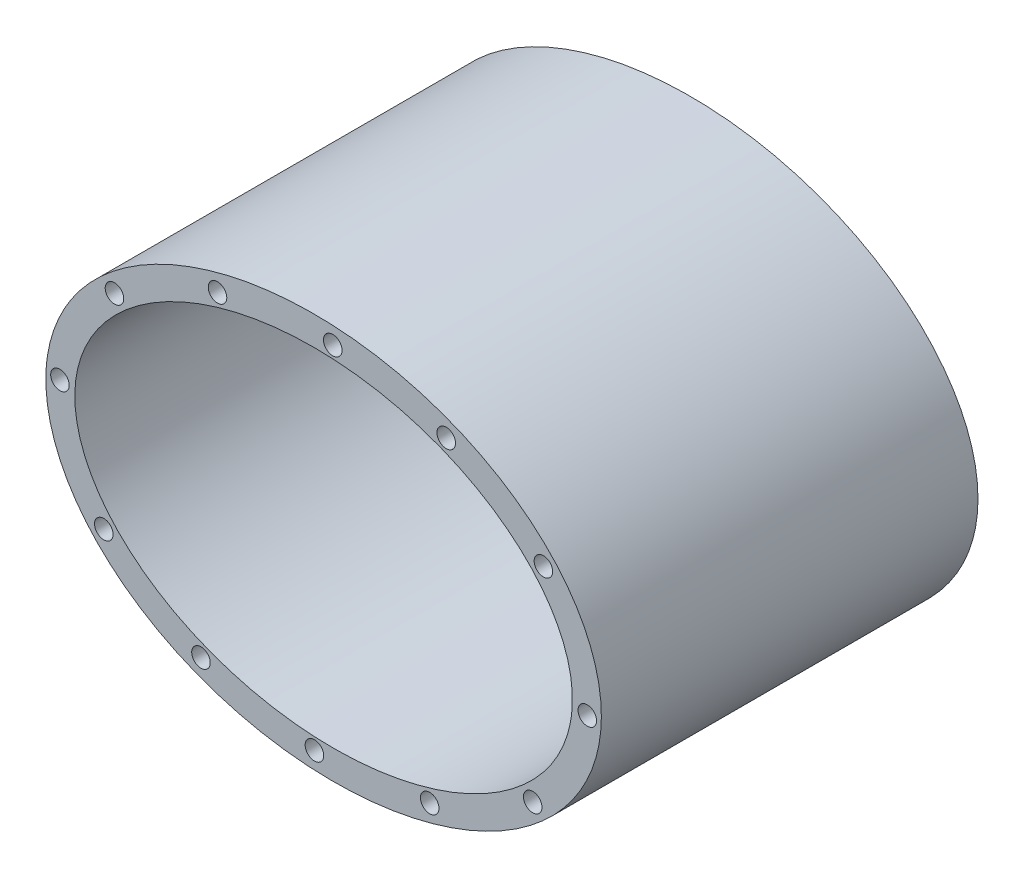
ISO-10303-21;
HEADER;
FILE_DESCRIPTION(('STEP AP214'),'2;1');
FILE_NAME('part.step','',(''),(''),'','','');
FILE_SCHEMA(('AUTOMOTIVE_DESIGN { 1 0 10303 214 1 1 1 1 }'));
ENDSEC;
DATA;
#1=APPLICATION_CONTEXT('core data for automotive mechanical design processes');
#2=APPLICATION_PROTOCOL_DEFINITION('international standard','automotive_design',2000,#1);
#3=PRODUCT_CONTEXT('',#1,'mechanical');
#4=PRODUCT('Part','Part','',(#3));
#5=PRODUCT_RELATED_PRODUCT_CATEGORY('part','',(#4));
#6=PRODUCT_DEFINITION_FORMATION('','',#4);
#7=PRODUCT_DEFINITION_CONTEXT('part definition',#1,'design');
#8=PRODUCT_DEFINITION('design','',#6,#7);
#9=PRODUCT_DEFINITION_SHAPE('','',#8);
#10=(LENGTH_UNIT() NAMED_UNIT(*) SI_UNIT(.MILLI.,.METRE.));
#11=(NAMED_UNIT(*) PLANE_ANGLE_UNIT() SI_UNIT($,.RADIAN.));
#12=(NAMED_UNIT(*) SI_UNIT($,.STERADIAN.) SOLID_ANGLE_UNIT());
#13=UNCERTAINTY_MEASURE_WITH_UNIT(LENGTH_MEASURE(1.E-05),#10,'distance_accuracy_value','');
#14=(GEOMETRIC_REPRESENTATION_CONTEXT(3) GLOBAL_UNCERTAINTY_ASSIGNED_CONTEXT((#13)) GLOBAL_UNIT_ASSIGNED_CONTEXT((#10,
#11,#12)) REPRESENTATION_CONTEXT('',''));
#15=CARTESIAN_POINT('',(0.,0.,0.));
#16=DIRECTION('',(0.,0.,1.));
#17=DIRECTION('',(1.,0.,0.));
#18=AXIS2_PLACEMENT_3D('',#15,#16,#17);
#19=CARTESIAN_POINT('',(0.,0.,20.6375));
#20=DIRECTION('',(0.,0.,1.));
#21=DIRECTION('',(-0.998703027385171,0.050914271984342,0.));
#22=AXIS2_PLACEMENT_3D('',#19,#20,#21);
#23=ELLIPSE('',#22,30.4596794607641,21.6340379427504);
#24=DIRECTION('',(0.,0.,-1.));
#25=VECTOR('',#24,1.);
#26=SURFACE_OF_LINEAR_EXTRUSION('',#23,#25);
#27=CARTESIAN_POINT('',(-30.420174090647,1.55083240462122,20.6375));
#28=VERTEX_POINT('',#27);
#29=EDGE_CURVE('E10',#28,#28,#23,.T.);
#30=ORIENTED_EDGE('',*,*,#29,.F.);
#31=EDGE_LOOP('',(#30));
#32=FACE_BOUND('',#31,.T.);
#33=CARTESIAN_POINT('',(0.,0.,-20.6375));
#34=DIRECTION('',(0.,0.,1.));
#35=DIRECTION('',(-0.998703027385171,0.050914271984342,0.));
#36=AXIS2_PLACEMENT_3D('',#33,#34,#35);
#37=ELLIPSE('',#36,30.4596794607641,21.6340379427504);
#38=CARTESIAN_POINT('',(-30.420174090647,1.55083240462122,-20.6375));
#39=VERTEX_POINT('',#38);
#40=EDGE_CURVE('E48',#39,#39,#37,.T.);
#41=ORIENTED_EDGE('',*,*,#40,.T.);
#42=EDGE_LOOP('',(#41));
#43=FACE_BOUND('',#42,.T.);
#44=ADVANCED_FACE('F44',(#32,#43),#26,.F.);
#45=CARTESIAN_POINT('',(0.,0.,20.6375));
#46=DIRECTION('',(0.,0.,1.));
#47=DIRECTION('',(1.,0.,0.));
#48=AXIS2_PLACEMENT_3D('',#45,#46,#47);
#49=PLANE('',#48);
#50=CARTESIAN_POINT('',(-28.8955886114168,1.4731084390134,20.6375));
#51=DIRECTION('',(0.,0.,1.));
#52=DIRECTION('',(1.,0.,0.));
#53=AXIS2_PLACEMENT_3D('',#50,#51,#52);
#54=CIRCLE('',#53,1.016);
#55=CARTESIAN_POINT('',(-27.8795886114168,1.4731084390134,20.6375));
#56=VERTEX_POINT('',#55);
#57=EDGE_CURVE('E100',#56,#56,#54,.T.);
#58=ORIENTED_EDGE('',*,*,#57,.F.);
#59=EDGE_LOOP('',(#58));
#60=FACE_BOUND('',#59,.T.);
#61=CARTESIAN_POINT('',(11.6259143111857,-18.4188890862015,20.6375));
#62=DIRECTION('',(0.,0.,1.));
#63=DIRECTION('',(1.,0.,0.));
#64=AXIS2_PLACEMENT_3D('',#61,#62,#63);
#65=CIRCLE('',#64,1.016);
#66=CARTESIAN_POINT('',(12.6419143111857,-18.4188890862015,20.6375));
#67=VERTEX_POINT('',#66);
#68=EDGE_CURVE('E122',#67,#67,#65,.T.);
#69=ORIENTED_EDGE('',*,*,#68,.F.);
#70=EDGE_LOOP('',(#69));
#71=FACE_BOUND('',#70,.T.);
#72=CARTESIAN_POINT('',(-24.0875774561187,-10.2815939702579,20.6375));
#73=DIRECTION('',(0.,0.,1.));
#74=DIRECTION('',(1.,0.,0.));
#75=AXIS2_PLACEMENT_3D('',#72,#73,#74);
#76=CIRCLE('',#75,1.016);
#77=CARTESIAN_POINT('',(-23.0715774561187,-10.2815939702579,20.6375));
#78=VERTEX_POINT('',#77);
#79=EDGE_CURVE('E153',#78,#78,#76,.T.);
#80=ORIENTED_EDGE('',*,*,#79,.F.);
#81=EDGE_LOOP('',(#80));
#82=FACE_BOUND('',#81,.T.);
#83=CARTESIAN_POINT('',(-13.4387755500165,-17.1410813677872,20.6375));
#84=DIRECTION('',(0.,0.,1.));
#85=DIRECTION('',(1.,0.,0.));
#86=AXIS2_PLACEMENT_3D('',#83,#84,#85);
#87=CIRCLE('',#86,1.016);
#88=CARTESIAN_POINT('',(-12.4227755500165,-17.1410813677872,20.6375));
#89=VERTEX_POINT('',#88);
#90=EDGE_CURVE('E154',#89,#89,#87,.T.);
#91=ORIENTED_EDGE('',*,*,#90,.F.);
#92=EDGE_LOOP('',(#91));
#93=FACE_BOUND('',#92,.T.);
#94=CARTESIAN_POINT('',(-11.6259143111857,18.4188890862015,20.6375));
#95=DIRECTION('',(0.,0.,1.));
#96=DIRECTION('',(1.,0.,0.));
#97=AXIS2_PLACEMENT_3D('',#94,#95,#96);
#98=CIRCLE('',#97,1.016);
#99=CARTESIAN_POINT('',(-10.6099143111857,18.4188890862015,20.6375));
#100=VERTEX_POINT('',#99);
#101=EDGE_CURVE('E105',#100,#100,#98,.T.);
#102=ORIENTED_EDGE('',*,*,#101,.F.);
#103=EDGE_LOOP('',(#102));
#104=FACE_BOUND('',#103,.T.);
#105=CARTESIAN_POINT('',(-1.00596941963839,-19.7324770775222,20.6375));
#106=DIRECTION('',(0.,0.,1.));
#107=DIRECTION('',(1.,0.,0.));
#108=AXIS2_PLACEMENT_3D('',#105,#106,#107);
#109=CIRCLE('',#108,1.016);
#110=CARTESIAN_POINT('',(0.010030580361613,-19.7324770775222,20.6375));
#111=VERTEX_POINT('',#110);
#112=EDGE_CURVE('E88',#111,#111,#109,.T.);
#113=ORIENTED_EDGE('',*,*,#112,.F.);
#114=EDGE_LOOP('',(#113));
#115=FACE_BOUND('',#114,.T.);
#116=CARTESIAN_POINT('',(28.8955886114168,-1.4731084390134,20.6375));
#117=DIRECTION('',(0.,0.,1.));
#118=DIRECTION('',(1.,0.,0.));
#119=AXIS2_PLACEMENT_3D('',#116,#117,#118);
#120=CIRCLE('',#119,1.016);
#121=CARTESIAN_POINT('',(29.9115886114168,-1.4731084390134,20.6375));
#122=VERTEX_POINT('',#121);
#123=EDGE_CURVE('E87',#122,#122,#120,.T.);
#124=ORIENTED_EDGE('',*,*,#123,.F.);
#125=EDGE_LOOP('',(#124));
#126=FACE_BOUND('',#125,.T.);
#127=CARTESIAN_POINT('',(1.00596941963839,19.7324770775222,20.6375));
#128=DIRECTION('',(0.,0.,1.));
#129=DIRECTION('',(1.,0.,0.));
#130=AXIS2_PLACEMENT_3D('',#127,#128,#129);
#131=CIRCLE('',#130,1.016);
#132=CARTESIAN_POINT('',(2.02196941963839,19.7324770775222,20.6375));
#133=VERTEX_POINT('',#132);
#134=EDGE_CURVE('E96',#133,#133,#131,.T.);
#135=ORIENTED_EDGE('',*,*,#134,.F.);
#136=EDGE_LOOP('',(#135));
#137=FACE_BOUND('',#136,.T.);
#138=CARTESIAN_POINT('',(-22.9170929145508,12.6779104989587,20.6375));
#139=DIRECTION('',(0.,0.,1.));
#140=DIRECTION('',(1.,0.,0.));
#141=AXIS2_PLACEMENT_3D('',#138,#139,#140);
#142=CIRCLE('',#141,1.016);
#143=CARTESIAN_POINT('',(-21.9010929145508,12.6779104989587,20.6375));
#144=VERTEX_POINT('',#143);
#145=EDGE_CURVE('E106',#144,#144,#142,.T.);
#146=ORIENTED_EDGE('',*,*,#145,.F.);
#147=EDGE_LOOP('',(#146));
#148=FACE_BOUND('',#147,.T.);
#149=CARTESIAN_POINT('',(13.4387755500165,17.1410813677872,20.6375));
#150=DIRECTION('',(0.,0.,1.));
#151=DIRECTION('',(1.,0.,0.));
#152=AXIS2_PLACEMENT_3D('',#149,#150,#151);
#153=CIRCLE('',#152,1.016);
#154=CARTESIAN_POINT('',(14.4547755500165,17.1410813677872,20.6375));
#155=VERTEX_POINT('',#154);
#156=EDGE_CURVE('E138',#155,#155,#153,.T.);
#157=ORIENTED_EDGE('',*,*,#156,.F.);
#158=EDGE_LOOP('',(#157));
#159=FACE_BOUND('',#158,.T.);
#160=CARTESIAN_POINT('',(24.0875774561187,10.2815939702579,20.6375));
#161=DIRECTION('',(0.,0.,1.));
#162=DIRECTION('',(1.,0.,0.));
#163=AXIS2_PLACEMENT_3D('',#160,#161,#162);
#164=CIRCLE('',#163,1.016);
#165=CARTESIAN_POINT('',(25.1035774561187,10.2815939702579,20.6375));
#166=VERTEX_POINT('',#165);
#167=EDGE_CURVE('E130',#166,#166,#164,.T.);
#168=ORIENTED_EDGE('',*,*,#167,.F.);
#169=EDGE_LOOP('',(#168));
#170=FACE_BOUND('',#169,.T.);
#171=CARTESIAN_POINT('',(22.9170929145508,-12.6779104989587,20.6375));
#172=DIRECTION('',(0.,0.,1.));
#173=DIRECTION('',(1.,0.,0.));
#174=AXIS2_PLACEMENT_3D('',#171,#172,#173);
#175=CIRCLE('',#174,1.016);
#176=CARTESIAN_POINT('',(23.9330929145508,-12.6779104989587,20.6375));
#177=VERTEX_POINT('',#176);
#178=EDGE_CURVE('E121',#177,#177,#175,.T.);
#179=ORIENTED_EDGE('',*,*,#178,.F.);
#180=EDGE_LOOP('',(#179));
#181=FACE_BOUND('',#180,.T.);
#182=CARTESIAN_POINT('',(27.2492919786991,-1.38917959107094,20.6375));
#183=CARTESIAN_POINT('',(27.2680366005136,-1.02141338593427,20.6375));
#184=CARTESIAN_POINT('',(27.2700916226353,-0.652746123175741,20.6375));
#185=CARTESIAN_POINT('',(27.2410310502674,0.0834214939327018,20.6375));
#186=CARTESIAN_POINT('',(27.2098988493856,0.450921171709255,20.6375));
#187=CARTESIAN_POINT('',(27.1153448440354,1.18241005164078,20.6375));
#188=CARTESIAN_POINT('',(27.0518637230276,1.54639154894286,20.6375));
#189=CARTESIAN_POINT('',(26.8941972634628,2.26756321183222,20.6375));
#190=CARTESIAN_POINT('',(26.8000149079984,2.62475403366991,20.6375));
#191=CARTESIAN_POINT('',(26.583757034224,3.32775225992819,20.6375));
#192=CARTESIAN_POINT('',(26.4618861879234,3.67362288558617,20.6375));
#193=CARTESIAN_POINT('',(26.1921354799995,4.35498857654193,20.6375));
#194=CARTESIAN_POINT('',(26.0442556543348,4.69048365618361,20.6375));
#195=CARTESIAN_POINT('',(25.5651153820672,5.67942966633351,20.6375));
#196=CARTESIAN_POINT('',(25.1982229095944,6.31575380036828,20.6375));
#197=CARTESIAN_POINT('',(24.1711717057279,7.86189680089104,20.6375));
#198=CARTESIAN_POINT('',(23.4588418677711,8.73709007950519,20.6375));
#199=CARTESIAN_POINT('',(22.2940205224214,9.95585254914562,20.6375));
#200=CARTESIAN_POINT('',(21.8889614401955,10.3469895241742,20.6375));
#201=CARTESIAN_POINT('',(21.0512177545388,11.0986827109796,20.6375));
#202=CARTESIAN_POINT('',(20.6185331754913,11.4592389497474,20.6375));
#203=CARTESIAN_POINT('',(19.536108181916,12.3010895588973,20.6375));
#204=CARTESIAN_POINT('',(18.873993786314,12.7664724579432,20.6375));
#205=CARTESIAN_POINT('',(17.5118298616798,13.6380496024422,20.6375));
#206=CARTESIAN_POINT('',(16.8117647606895,14.0442192954239,20.6375));
#207=CARTESIAN_POINT('',(15.3810459554175,14.8001050146882,20.6375));
#208=CARTESIAN_POINT('',(14.6503632225458,15.1497658667581,20.6375));
#209=CARTESIAN_POINT('',(13.1654271644962,15.7943781979705,20.6375));
#210=CARTESIAN_POINT('',(12.4111743042413,16.0893307554447,20.6375));
#211=CARTESIAN_POINT('',(10.6418079792486,16.7117018374752,20.6375));
#212=CARTESIAN_POINT('',(9.61984508404543,17.0197375687995,20.6375));
#213=CARTESIAN_POINT('',(7.55326119338537,17.5474868907354,20.6375));
#214=CARTESIAN_POINT('',(6.50863332462111,17.7671732828178,20.6375));
#215=CARTESIAN_POINT('',(4.40374564856037,18.1203022009913,20.6375));
#216=CARTESIAN_POINT('',(3.34346970798796,18.2536482765864,20.6375));
#217=CARTESIAN_POINT('',(1.21577940916763,18.4344544921062,20.6375));
#218=CARTESIAN_POINT('',(0.148365905960948,18.481924740831,20.6375));
#219=CARTESIAN_POINT('',(-1.99772120832002,18.4906029583385,20.6375));
#220=CARTESIAN_POINT('',(-3.07639893921402,18.4509287794114,20.6375));
#221=CARTESIAN_POINT('',(-5.2269295524424,18.2817501379446,20.6375));
#222=CARTESIAN_POINT('',(-6.29878104461819,18.1522279332938,20.6375));
#223=CARTESIAN_POINT('',(-8.42560840388261,17.8004541651849,20.6375));
#224=CARTESIAN_POINT('',(-9.48061027537535,17.5783635351392,20.6375));
#225=CARTESIAN_POINT('',(-11.0437031243087,17.172428839118,20.6375));
#226=CARTESIAN_POINT('',(-11.5614440698733,17.0250040515521,20.6375));
#227=CARTESIAN_POINT('',(-12.5891151620363,16.705137350933,20.6375));
#228=CARTESIAN_POINT('',(-13.0990462484836,16.5326984746811,20.6375));
#229=CARTESIAN_POINT('',(-14.2337932758017,16.1163716820319,20.6375));
#230=CARTESIAN_POINT('',(-14.8560105267036,15.8653427481447,20.6375));
#231=CARTESIAN_POINT('',(-16.081895947726,15.3214231423029,20.6375));
#232=CARTESIAN_POINT('',(-16.6855653588173,15.0285352784253,20.6375));
#233=CARTESIAN_POINT('',(-17.8690646293229,14.3992672045237,20.6375));
#234=CARTESIAN_POINT('',(-18.4489194502432,14.0629341491025,20.6375));
#235=CARTESIAN_POINT('',(-19.5795888704974,13.3445304799033,20.6375));
#236=CARTESIAN_POINT('',(-20.1304113584067,12.9624723836381,20.6375));
#237=CARTESIAN_POINT('',(-21.0583882311174,12.2553964894475,20.6375));
#238=CARTESIAN_POINT('',(-21.4437018860705,11.9410709841346,20.6375));
#239=CARTESIAN_POINT('',(-22.1907904848536,11.2855068478618,20.6375));
#240=CARTESIAN_POINT('',(-22.5525662004534,10.9442691001218,20.6375));
#241=CARTESIAN_POINT('',(-23.2480642732244,10.2347969201341,20.6375));
#242=CARTESIAN_POINT('',(-23.5818153544713,9.8665908725107,20.6375));
#243=CARTESIAN_POINT('',(-24.0578982689133,9.29408077455736,20.6375));
#244=CARTESIAN_POINT('',(-24.2124928934144,9.09989024527756,20.6375));
#245=CARTESIAN_POINT('',(-24.5129187752533,8.70475772511014,20.6375));
#246=CARTESIAN_POINT('',(-24.6587478119425,8.50381404333274,20.6375));
#247=CARTESIAN_POINT('',(-25.0190946791282,7.98213573027866,20.6375));
#248=CARTESIAN_POINT('',(-25.226901171827,7.65671823149363,20.6375));
#249=CARTESIAN_POINT('',(-25.6167325332233,6.99086687506302,20.6375));
#250=CARTESIAN_POINT('',(-25.7987636069451,6.65043665745989,20.6375));
#251=CARTESIAN_POINT('',(-26.1342021650939,5.95593825796738,20.6375));
#252=CARTESIAN_POINT('',(-26.2876263003511,5.60187815514288,20.6375));
#253=CARTESIAN_POINT('',(-26.563265159795,4.88176022433971,20.6375));
#254=CARTESIAN_POINT('',(-26.6854796608856,4.51570231061812,20.6375));
#255=CARTESIAN_POINT('',(-26.8970701080686,3.77130600908812,20.6375));
#256=CARTESIAN_POINT('',(-26.9862020043824,3.39289792021969,20.6375));
#257=CARTESIAN_POINT('',(-27.128512705436,2.62935518711607,20.6375));
#258=CARTESIAN_POINT('',(-27.1816916954062,2.24422057754662,20.6375));
#259=CARTESIAN_POINT('',(-27.2510465395559,1.47073447189406,20.6375));
#260=CARTESIAN_POINT('',(-27.2672324517332,1.08238387902723,20.6375));
#261=CARTESIAN_POINT('',(-27.262539969567,0.305929441664681,20.6375));
#262=CARTESIAN_POINT('',(-27.2416638150059,-0.0821744163241208,20.6375));
#263=CARTESIAN_POINT('',(-27.167946544399,-0.812931012481122,20.6375));
#264=CARTESIAN_POINT('',(-27.1188019415678,-1.15596478843195,20.6375));
#265=CARTESIAN_POINT('',(-26.9929124388779,-1.8368743886217,20.6375));
#266=CARTESIAN_POINT('',(-26.9161705546501,-2.1747507722195,20.6375));
#267=CARTESIAN_POINT('',(-26.7366116159877,-2.84357658606893,20.6375));
#268=CARTESIAN_POINT('',(-26.6337870473739,-3.17452399035235,20.6375));
#269=CARTESIAN_POINT('',(-26.4038695432231,-3.82790179655031,20.6375));
#270=CARTESIAN_POINT('',(-26.2767715011973,-4.15033039005896,20.6375));
#271=CARTESIAN_POINT('',(-25.9508148510375,-4.89890671456069,20.6375));
#272=CARTESIAN_POINT('',(-25.7425387226978,-5.32097243937792,20.6375));
#273=CARTESIAN_POINT('',(-25.2896288503049,-6.14511055850806,20.6375));
#274=CARTESIAN_POINT('',(-25.0449843316567,-6.54717698050215,20.6375));
#275=CARTESIAN_POINT('',(-24.5235269658879,-7.33069413466734,20.6375));
#276=CARTESIAN_POINT('',(-24.2466650376008,-7.71211208015901,20.6375));
#277=CARTESIAN_POINT('',(-23.665244851732,-8.453111347485,20.6375));
#278=CARTESIAN_POINT('',(-23.360685382509,-8.81269171287597,20.6375));
#279=CARTESIAN_POINT('',(-22.5977029076945,-9.65289871792476,20.6375));
#280=CARTESIAN_POINT('',(-22.1273737507642,-10.1227425033659,20.6375));
#281=CARTESIAN_POINT('',(-21.1475180439042,-11.0196010266666,20.6375));
#282=CARTESIAN_POINT('',(-20.6379762362066,-11.4465989426541,20.6375));
#283=CARTESIAN_POINT('',(-19.5860862990465,-12.2594222380508,20.6375));
#284=CARTESIAN_POINT('',(-19.0436955690763,-12.6451922782977,20.6375));
#285=CARTESIAN_POINT('',(-17.9324798510159,-13.376294144642,20.6375));
#286=CARTESIAN_POINT('',(-17.3636549138554,-13.7216260486453,20.6375));
#287=CARTESIAN_POINT('',(-15.963266824719,-14.5087353520448,20.6375));
#288=CARTESIAN_POINT('',(-15.1206979203483,-14.9310040669565,20.6375));
#289=CARTESIAN_POINT('',(-13.4021831542261,-15.7012329382343,20.6375));
#290=CARTESIAN_POINT('',(-12.5262240180151,-16.0491631701051,20.6375));
#291=CARTESIAN_POINT('',(-10.7487400429391,-16.6737842145345,20.6375));
#292=CARTESIAN_POINT('',(-9.84719926575276,-16.9504294817589,20.6375));
#293=CARTESIAN_POINT('',(-8.02591580109309,-17.4344130874839,20.6375));
#294=CARTESIAN_POINT('',(-7.10617524102246,-17.6417594763449,20.6375));
#295=CARTESIAN_POINT('',(-5.2300364001891,-17.9932068567273,20.6375));
#296=CARTESIAN_POINT('',(-4.27330582836681,-18.1355295404431,20.6375));
#297=CARTESIAN_POINT('',(-2.35195664166505,-18.3496969183686,20.6375));
#298=CARTESIAN_POINT('',(-1.38733752964344,-18.421537135661,20.6375));
#299=CARTESIAN_POINT('',(0.544611799735908,-18.4947285854998,20.6375));
#300=CARTESIAN_POINT('',(1.51194212008835,-18.4960771028581,20.6375));
#301=CARTESIAN_POINT('',(3.44404031265046,-18.4274550500411,20.6375));
#302=CARTESIAN_POINT('',(4.40880838351173,-18.3574901808426,20.6375));
#303=CARTESIAN_POINT('',(6.27944525888811,-18.1502055475193,20.6375));
#304=CARTESIAN_POINT('',(7.18572961761516,-18.0166453408384,20.6375));
#305=CARTESIAN_POINT('',(8.9859234113501,-17.6818462248702,20.6375));
#306=CARTESIAN_POINT('',(9.87983147231205,-17.480599862652,20.6375));
#307=CARTESIAN_POINT('',(11.6479419734016,-17.0077361159442,20.6375));
#308=CARTESIAN_POINT('',(12.5221639326718,-16.7361921038402,20.6375));
#309=CARTESIAN_POINT('',(14.2439425691872,-16.1189433730454,20.6375));
#310=CARTESIAN_POINT('',(15.0915106019222,-15.7732707402707,20.6375));
#311=CARTESIAN_POINT('',(16.4777362287871,-15.129755318893,20.6375));
#312=CARTESIAN_POINT('',(17.0264545442781,-14.8534690225695,20.6375));
#313=CARTESIAN_POINT('',(18.1037218890621,-14.2638464849689,20.6375));
#314=CARTESIAN_POINT('',(18.6322716460473,-13.9505115821004,20.6375));
#315=CARTESIAN_POINT('',(19.6640255680649,-13.2855985016335,20.6375));
#316=CARTESIAN_POINT('',(20.1672564933433,-12.9340619978852,20.6375));
#317=CARTESIAN_POINT('',(21.1433123732973,-12.1910188129967,20.6375));
#318=CARTESIAN_POINT('',(21.6161459056668,-11.7995234890511,20.6375));
#319=CARTESIAN_POINT('',(22.4094201667989,-11.0798720010432,20.6375));
#320=CARTESIAN_POINT('',(22.7381166797233,-10.7608029397259,20.6375));
#321=CARTESIAN_POINT('',(23.3713815290736,-10.0994889836664,20.6375));
#322=CARTESIAN_POINT('',(23.6759507835228,-9.75724497163274,20.6375));
#323=CARTESIAN_POINT('',(24.2569423148323,-9.04986479495615,20.6375));
#324=CARTESIAN_POINT('',(24.5333837799765,-8.68474451458629,20.6375));
#325=CARTESIAN_POINT('',(24.9237471818542,-8.12044170847745,20.6375));
#326=CARTESIAN_POINT('',(25.0498112473503,-7.92958308451818,20.6375));
#327=CARTESIAN_POINT('',(25.2933430229501,-7.54238236693642,20.6375));
#328=CARTESIAN_POINT('',(25.4108085140607,-7.34603887579569,20.6375));
#329=CARTESIAN_POINT('',(25.7048304414666,-6.82767882494733,20.6375));
#330=CARTESIAN_POINT('',(25.8741370104618,-6.50150286064564,20.6375));
#331=CARTESIAN_POINT('',(26.1865244873994,-5.83689295577473,20.6375));
#332=CARTESIAN_POINT('',(26.3296111502998,-5.49846172466806,20.6375));
#333=CARTESIAN_POINT('',(26.5870229379359,-4.81161637975738,20.6375));
#334=CARTESIAN_POINT('',(26.7014088085049,-4.46322511887519,20.6375));
#335=CARTESIAN_POINT('',(26.8997347724315,-3.75800707698262,20.6375));
#336=CARTESIAN_POINT('',(26.9836896504523,-3.401184482272,20.6375));
#337=CARTESIAN_POINT('',(27.1032105263996,-2.7686780195398,20.6375));
#338=CARTESIAN_POINT('',(27.1455704226105,-2.49426171690366,20.6375));
#339=CARTESIAN_POINT('',(27.2115479626765,-1.94312777879922,20.6375));
#340=CARTESIAN_POINT('',(27.235161878079,-1.66640969657559,20.6375));
#341=CARTESIAN_POINT('',(27.2492919786991,-1.38917959107094,20.6375));
#342=B_SPLINE_CURVE_WITH_KNOTS('',3,(#182,#183,#184,#185,#186,#187,#188,#189,#190,#191,#192,
#193,#194,#195,#196,#197,#198,#199,#200,#201,#202,#203,#204,#205,#206,#207,#208,#209,#210,#211,
#212,#213,#214,#215,#216,#217,#218,#219,#220,#221,#222,#223,#224,#225,#226,#227,#228,#229,#230,
#231,#232,#233,#234,#235,#236,#237,#238,#239,#240,#241,#242,#243,#244,#245,#246,#247,#248,#249,
#250,#251,#252,#253,#254,#255,#256,#257,#258,#259,#260,#261,#262,#263,#264,#265,#266,#267,#268,
#269,#270,#271,#272,#273,#274,#275,#276,#277,#278,#279,#280,#281,#282,#283,#284,#285,#286,#287,
#288,#289,#290,#291,#292,#293,#294,#295,#296,#297,#298,#299,#300,#301,#302,#303,#304,#305,#306,
#307,#308,#309,#310,#311,#312,#313,#314,#315,#316,#317,#318,#319,#320,#321,#322,#323,#324,#325,
#326,#327,#328,#329,#330,#331,#332,#333,#334,#335,#336,#337,#338,#339,#340,#341),.UNSPECIFIED.,
.T.,.F.,(4,2,2,2,2,2,2,2,2,2,2,2,2,2,2,2,2,2,2,2,2,2,2,2,2,2,2,2,2,2,2,2,2,2,2,2,2,2,2,2,2,2,2,
2,2,2,2,2,2,2,2,2,2,2,2,2,2,2,2,2,2,2,2,2,2,2,2,2,2,2,2,2,2,2,2,2,2,2,2,4),(0.,1.10444297918903,
2.20943886472677,3.31646825418512,4.42339011091891,5.52238153736515,6.62137144441769,
8.81806593508827,12.1835640003252,13.8717629137829,15.5599603371964,17.9843251264416,
20.4096923250437,22.8374134853041,25.2650867887125,28.4628824000782,31.6616617073146,
34.8640082238616,38.0659777543648,41.3005094989392,44.5356801419615,47.7652496353197,
49.3796847949648,50.9939241200871,53.0052826332734,55.0165062791652,57.0255650397976,
59.0340750608296,60.5247140010787,62.0153040410959,63.5043471498704,64.2487739095656,
64.9933884721628,66.1505809374938,67.3074943517037,68.4637322613552,69.6199784359189,
70.7845922395311,71.9492000429696,73.11349116508,74.277711927653,75.3161713797742,
76.3545173910398,77.3931628805626,78.4320271144525,79.8419016434353,81.252194701072,
82.6646650933493,84.077197304522,86.0685942829606,88.0607700766904,90.055587194071,
92.0504004682787,94.8736774318868,97.6980887558023,100.524300200771,103.350183214228,
106.249300977582,109.148602875674,112.048016448534,114.947198252947,117.692986460319,
120.439077105805,123.182313025232,125.924363947338,127.766167008387,129.607903553246,
131.447650755764,133.286876509238,134.660059881597,136.033190980282,137.405378982659,
138.091385440516,138.777568313185,139.878929688389,140.980049037548,142.078817803151,
143.17705202261,144.00943947029,144.841992432928),.UNSPECIFIED.);
#343=CARTESIAN_POINT('',(27.2492919786991,-1.38917959107094,20.6375));
#344=VERTEX_POINT('',#343);
#345=EDGE_CURVE('E56',#344,#344,#342,.T.);
#346=ORIENTED_EDGE('',*,*,#345,.F.);
#347=EDGE_LOOP('',(#346));
#348=FACE_BOUND('',#347,.T.);
#349=ORIENTED_EDGE('',*,*,#29,.T.);
#350=EDGE_LOOP('',(#349));
#351=FACE_BOUND('',#350,.T.);
#352=ADVANCED_FACE('F195',(#60,#71,#82,#93,#104,#115,#126,#137,#148,#159,#170,#181,#348,#351),
#49,.T.);
#353=CARTESIAN_POINT('',(0.,0.,-20.6375));
#354=DIRECTION('',(0.,0.,1.));
#355=DIRECTION('',(1.,0.,0.));
#356=AXIS2_PLACEMENT_3D('',#353,#354,#355);
#357=PLANE('',#356);
#358=CARTESIAN_POINT('',(-28.8955886114168,1.4731084390134,-20.6375));
#359=DIRECTION('',(0.,0.,1.));
#360=DIRECTION('',(1.,0.,0.));
#361=AXIS2_PLACEMENT_3D('',#358,#359,#360);
#362=CIRCLE('',#361,1.016);
#363=CARTESIAN_POINT('',(-27.8795886114168,1.4731084390134,-20.6375));
#364=VERTEX_POINT('',#363);
#365=EDGE_CURVE('E175',#364,#364,#362,.T.);
#366=ORIENTED_EDGE('',*,*,#365,.T.);
#367=EDGE_LOOP('',(#366));
#368=FACE_BOUND('',#367,.T.);
#369=CARTESIAN_POINT('',(11.6259143111857,-18.4188890862015,-20.6375));
#370=DIRECTION('',(0.,0.,1.));
#371=DIRECTION('',(1.,0.,0.));
#372=AXIS2_PLACEMENT_3D('',#369,#370,#371);
#373=CIRCLE('',#372,1.016);
#374=CARTESIAN_POINT('',(12.6419143111857,-18.4188890862015,-20.6375));
#375=VERTEX_POINT('',#374);
#376=EDGE_CURVE('E158',#375,#375,#373,.T.);
#377=ORIENTED_EDGE('',*,*,#376,.T.);
#378=EDGE_LOOP('',(#377));
#379=FACE_BOUND('',#378,.T.);
#380=CARTESIAN_POINT('',(-24.0875774561187,-10.2815939702579,-20.6375));
#381=DIRECTION('',(0.,0.,1.));
#382=DIRECTION('',(1.,0.,0.));
#383=AXIS2_PLACEMENT_3D('',#380,#381,#382);
#384=CIRCLE('',#383,1.016);
#385=CARTESIAN_POINT('',(-23.0715774561187,-10.2815939702579,-20.6375));
#386=VERTEX_POINT('',#385);
#387=EDGE_CURVE('E149',#386,#386,#384,.T.);
#388=ORIENTED_EDGE('',*,*,#387,.T.);
#389=EDGE_LOOP('',(#388));
#390=FACE_BOUND('',#389,.T.);
#391=CARTESIAN_POINT('',(-13.4387755500165,-17.1410813677872,-20.6375));
#392=DIRECTION('',(0.,0.,1.));
#393=DIRECTION('',(1.,0.,0.));
#394=AXIS2_PLACEMENT_3D('',#391,#392,#393);
#395=CIRCLE('',#394,1.016);
#396=CARTESIAN_POINT('',(-12.4227755500165,-17.1410813677872,-20.6375));
#397=VERTEX_POINT('',#396);
#398=EDGE_CURVE('E165',#397,#397,#395,.T.);
#399=ORIENTED_EDGE('',*,*,#398,.T.);
#400=EDGE_LOOP('',(#399));
#401=FACE_BOUND('',#400,.T.);
#402=CARTESIAN_POINT('',(-11.6259143111857,18.4188890862015,-20.6375));
#403=DIRECTION('',(0.,0.,1.));
#404=DIRECTION('',(1.,0.,0.));
#405=AXIS2_PLACEMENT_3D('',#402,#403,#404);
#406=CIRCLE('',#405,1.016);
#407=CARTESIAN_POINT('',(-10.6099143111857,18.4188890862015,-20.6375));
#408=VERTEX_POINT('',#407);
#409=EDGE_CURVE('E101',#408,#408,#406,.T.);
#410=ORIENTED_EDGE('',*,*,#409,.T.);
#411=EDGE_LOOP('',(#410));
#412=FACE_BOUND('',#411,.T.);
#413=CARTESIAN_POINT('',(-1.00596941963839,-19.7324770775222,-20.6375));
#414=DIRECTION('',(0.,0.,1.));
#415=DIRECTION('',(1.,0.,0.));
#416=AXIS2_PLACEMENT_3D('',#413,#414,#415);
#417=CIRCLE('',#416,1.016);
#418=CARTESIAN_POINT('',(0.010030580361613,-19.7324770775222,-20.6375));
#419=VERTEX_POINT('',#418);
#420=EDGE_CURVE('E110',#419,#419,#417,.T.);
#421=ORIENTED_EDGE('',*,*,#420,.T.);
#422=EDGE_LOOP('',(#421));
#423=FACE_BOUND('',#422,.T.);
#424=CARTESIAN_POINT('',(28.8955886114168,-1.4731084390134,-20.6375));
#425=DIRECTION('',(0.,0.,1.));
#426=DIRECTION('',(1.,0.,0.));
#427=AXIS2_PLACEMENT_3D('',#424,#425,#426);
#428=CIRCLE('',#427,1.016);
#429=CARTESIAN_POINT('',(29.9115886114168,-1.4731084390134,-20.6375));
#430=VERTEX_POINT('',#429);
#431=EDGE_CURVE('E83',#430,#430,#428,.T.);
#432=ORIENTED_EDGE('',*,*,#431,.T.);
#433=EDGE_LOOP('',(#432));
#434=FACE_BOUND('',#433,.T.);
#435=CARTESIAN_POINT('',(1.00596941963839,19.7324770775222,-20.6375));
#436=DIRECTION('',(0.,0.,1.));
#437=DIRECTION('',(1.,0.,0.));
#438=AXIS2_PLACEMENT_3D('',#435,#436,#437);
#439=CIRCLE('',#438,1.016);
#440=CARTESIAN_POINT('',(2.02196941963839,19.7324770775222,-20.6375));
#441=VERTEX_POINT('',#440);
#442=EDGE_CURVE('E92',#441,#441,#439,.T.);
#443=ORIENTED_EDGE('',*,*,#442,.T.);
#444=EDGE_LOOP('',(#443));
#445=FACE_BOUND('',#444,.T.);
#446=CARTESIAN_POINT('',(-22.9170929145508,12.6779104989587,-20.6375));
#447=DIRECTION('',(0.,0.,1.));
#448=DIRECTION('',(1.,0.,0.));
#449=AXIS2_PLACEMENT_3D('',#446,#447,#448);
#450=CIRCLE('',#449,1.016);
#451=CARTESIAN_POINT('',(-21.9010929145508,12.6779104989587,-20.6375));
#452=VERTEX_POINT('',#451);
#453=EDGE_CURVE('E142',#452,#452,#450,.T.);
#454=ORIENTED_EDGE('',*,*,#453,.T.);
#455=EDGE_LOOP('',(#454));
#456=FACE_BOUND('',#455,.T.);
#457=CARTESIAN_POINT('',(13.4387755500165,17.1410813677872,-20.6375));
#458=DIRECTION('',(0.,0.,1.));
#459=DIRECTION('',(1.,0.,0.));
#460=AXIS2_PLACEMENT_3D('',#457,#458,#459);
#461=CIRCLE('',#460,1.016);
#462=CARTESIAN_POINT('',(14.4547755500165,17.1410813677872,-20.6375));
#463=VERTEX_POINT('',#462);
#464=EDGE_CURVE('E134',#463,#463,#461,.T.);
#465=ORIENTED_EDGE('',*,*,#464,.T.);
#466=EDGE_LOOP('',(#465));
#467=FACE_BOUND('',#466,.T.);
#468=CARTESIAN_POINT('',(24.0875774561187,10.2815939702579,-20.6375));
#469=DIRECTION('',(0.,0.,1.));
#470=DIRECTION('',(1.,0.,0.));
#471=AXIS2_PLACEMENT_3D('',#468,#469,#470);
#472=CIRCLE('',#471,1.016);
#473=CARTESIAN_POINT('',(25.1035774561187,10.2815939702579,-20.6375));
#474=VERTEX_POINT('',#473);
#475=EDGE_CURVE('E126',#474,#474,#472,.T.);
#476=ORIENTED_EDGE('',*,*,#475,.T.);
#477=EDGE_LOOP('',(#476));
#478=FACE_BOUND('',#477,.T.);
#479=CARTESIAN_POINT('',(22.9170929145508,-12.6779104989587,-20.6375));
#480=DIRECTION('',(0.,0.,1.));
#481=DIRECTION('',(1.,0.,0.));
#482=AXIS2_PLACEMENT_3D('',#479,#480,#481);
#483=CIRCLE('',#482,1.016);
#484=CARTESIAN_POINT('',(23.9330929145508,-12.6779104989587,-20.6375));
#485=VERTEX_POINT('',#484);
#486=EDGE_CURVE('E117',#485,#485,#483,.T.);
#487=ORIENTED_EDGE('',*,*,#486,.T.);
#488=EDGE_LOOP('',(#487));
#489=FACE_BOUND('',#488,.T.);
#490=ORIENTED_EDGE('',*,*,#40,.F.);
#491=EDGE_LOOP('',(#490));
#492=FACE_BOUND('',#491,.T.);
#493=ADVANCED_FACE('F187',(#368,#379,#390,#401,#412,#423,#434,#445,#456,#467,#478,#489,#492),
#357,.F.);
#494=CARTESIAN_POINT('',(0.,0.,20.6375));
#495=DIRECTION('',(0.,0.,1.));
#496=DIRECTION('',(-0.998703027385171,0.050914271984342,0.));
#497=AXIS2_PLACEMENT_3D('',#494,#495,#496);
#498=ELLIPSE('',#497,30.4596794607641,21.6340379427504);
#499=DIRECTION('',(0.,0.,-1.));
#500=VECTOR('',#499,1.);
#501=SURFACE_OF_LINEAR_EXTRUSION('',#498,#500);
#502=OFFSET_SURFACE('',#501,3.175,.F.);
#503=ORIENTED_EDGE('',*,*,#345,.T.);
#504=EDGE_LOOP('',(#503));
#505=FACE_BOUND('',#504,.T.);
#506=CARTESIAN_POINT('',(27.2492919786991,-1.38917959107094,-17.4625));
#507=CARTESIAN_POINT('',(27.2680366005136,-1.02141338593427,-17.4625));
#508=CARTESIAN_POINT('',(27.2700916226353,-0.652746123175741,-17.4625));
#509=CARTESIAN_POINT('',(27.2410310502674,0.0834214939327018,-17.4625));
#510=CARTESIAN_POINT('',(27.2098988493856,0.450921171709255,-17.4625));
#511=CARTESIAN_POINT('',(27.1153448440354,1.18241005164078,-17.4625));
#512=CARTESIAN_POINT('',(27.0518637230276,1.54639154894286,-17.4625));
#513=CARTESIAN_POINT('',(26.8941972634628,2.26756321183222,-17.4625));
#514=CARTESIAN_POINT('',(26.8000149079984,2.62475403366991,-17.4625));
#515=CARTESIAN_POINT('',(26.583757034224,3.32775225992819,-17.4625));
#516=CARTESIAN_POINT('',(26.4618861879234,3.67362288558617,-17.4625));
#517=CARTESIAN_POINT('',(26.1921354799995,4.35498857654193,-17.4625));
#518=CARTESIAN_POINT('',(26.0442556543348,4.69048365618361,-17.4625));
#519=CARTESIAN_POINT('',(25.5651153820672,5.67942966633351,-17.4625));
#520=CARTESIAN_POINT('',(25.1982229095944,6.31575380036828,-17.4625));
#521=CARTESIAN_POINT('',(24.1711717057279,7.86189680089104,-17.4625));
#522=CARTESIAN_POINT('',(23.4588418677711,8.73709007950519,-17.4625));
#523=CARTESIAN_POINT('',(22.2940205224214,9.95585254914562,-17.4625));
#524=CARTESIAN_POINT('',(21.8889614401955,10.3469895241742,-17.4625));
#525=CARTESIAN_POINT('',(21.0512177545388,11.0986827109796,-17.4625));
#526=CARTESIAN_POINT('',(20.6185331754913,11.4592389497474,-17.4625));
#527=CARTESIAN_POINT('',(19.536108181916,12.3010895588973,-17.4625));
#528=CARTESIAN_POINT('',(18.873993786314,12.7664724579432,-17.4625));
#529=CARTESIAN_POINT('',(17.5118298616798,13.6380496024422,-17.4625));
#530=CARTESIAN_POINT('',(16.8117647606895,14.0442192954239,-17.4625));
#531=CARTESIAN_POINT('',(15.3810459554175,14.8001050146882,-17.4625));
#532=CARTESIAN_POINT('',(14.6503632225458,15.1497658667581,-17.4625));
#533=CARTESIAN_POINT('',(13.1654271644962,15.7943781979705,-17.4625));
#534=CARTESIAN_POINT('',(12.4111743042413,16.0893307554447,-17.4625));
#535=CARTESIAN_POINT('',(10.6418079792486,16.7117018374752,-17.4625));
#536=CARTESIAN_POINT('',(9.61984508404543,17.0197375687995,-17.4625));
#537=CARTESIAN_POINT('',(7.55326119338537,17.5474868907354,-17.4625));
#538=CARTESIAN_POINT('',(6.50863332462111,17.7671732828178,-17.4625));
#539=CARTESIAN_POINT('',(4.40374564856037,18.1203022009913,-17.4625));
#540=CARTESIAN_POINT('',(3.34346970798796,18.2536482765864,-17.4625));
#541=CARTESIAN_POINT('',(1.21577940916763,18.4344544921062,-17.4625));
#542=CARTESIAN_POINT('',(0.148365905960948,18.481924740831,-17.4625));
#543=CARTESIAN_POINT('',(-1.99772120832002,18.4906029583385,-17.4625));
#544=CARTESIAN_POINT('',(-3.07639893921402,18.4509287794114,-17.4625));
#545=CARTESIAN_POINT('',(-5.2269295524424,18.2817501379446,-17.4625));
#546=CARTESIAN_POINT('',(-6.29878104461819,18.1522279332938,-17.4625));
#547=CARTESIAN_POINT('',(-8.42560840388261,17.8004541651849,-17.4625));
#548=CARTESIAN_POINT('',(-9.48061027537535,17.5783635351392,-17.4625));
#549=CARTESIAN_POINT('',(-11.0437031243087,17.172428839118,-17.4625));
#550=CARTESIAN_POINT('',(-11.5614440698733,17.0250040515521,-17.4625));
#551=CARTESIAN_POINT('',(-12.5891151620363,16.705137350933,-17.4625));
#552=CARTESIAN_POINT('',(-13.0990462484836,16.5326984746811,-17.4625));
#553=CARTESIAN_POINT('',(-14.2337932758017,16.1163716820319,-17.4625));
#554=CARTESIAN_POINT('',(-14.8560105267036,15.8653427481447,-17.4625));
#555=CARTESIAN_POINT('',(-16.081895947726,15.3214231423029,-17.4625));
#556=CARTESIAN_POINT('',(-16.6855653588173,15.0285352784253,-17.4625));
#557=CARTESIAN_POINT('',(-17.8690646293229,14.3992672045237,-17.4625));
#558=CARTESIAN_POINT('',(-18.4489194502432,14.0629341491025,-17.4625));
#559=CARTESIAN_POINT('',(-19.5795888704974,13.3445304799033,-17.4625));
#560=CARTESIAN_POINT('',(-20.1304113584067,12.9624723836381,-17.4625));
#561=CARTESIAN_POINT('',(-21.0583882311174,12.2553964894475,-17.4625));
#562=CARTESIAN_POINT('',(-21.4437018860705,11.9410709841346,-17.4625));
#563=CARTESIAN_POINT('',(-22.1907904848536,11.2855068478618,-17.4625));
#564=CARTESIAN_POINT('',(-22.5525662004534,10.9442691001218,-17.4625));
#565=CARTESIAN_POINT('',(-23.2480642732244,10.2347969201341,-17.4625));
#566=CARTESIAN_POINT('',(-23.5818153544713,9.8665908725107,-17.4625));
#567=CARTESIAN_POINT('',(-24.0578982689133,9.29408077455736,-17.4625));
#568=CARTESIAN_POINT('',(-24.2124928934144,9.09989024527756,-17.4625));
#569=CARTESIAN_POINT('',(-24.5129187752533,8.70475772511014,-17.4625));
#570=CARTESIAN_POINT('',(-24.6587478119425,8.50381404333274,-17.4625));
#571=CARTESIAN_POINT('',(-25.0190946791282,7.98213573027866,-17.4625));
#572=CARTESIAN_POINT('',(-25.226901171827,7.65671823149363,-17.4625));
#573=CARTESIAN_POINT('',(-25.6167325332233,6.99086687506302,-17.4625));
#574=CARTESIAN_POINT('',(-25.7987636069451,6.65043665745989,-17.4625));
#575=CARTESIAN_POINT('',(-26.1342021650939,5.95593825796738,-17.4625));
#576=CARTESIAN_POINT('',(-26.2876263003511,5.60187815514288,-17.4625));
#577=CARTESIAN_POINT('',(-26.563265159795,4.88176022433971,-17.4625));
#578=CARTESIAN_POINT('',(-26.6854796608856,4.51570231061812,-17.4625));
#579=CARTESIAN_POINT('',(-26.8970701080686,3.77130600908812,-17.4625));
#580=CARTESIAN_POINT('',(-26.9862020043824,3.39289792021969,-17.4625));
#581=CARTESIAN_POINT('',(-27.128512705436,2.62935518711607,-17.4625));
#582=CARTESIAN_POINT('',(-27.1816916954062,2.24422057754662,-17.4625));
#583=CARTESIAN_POINT('',(-27.2510465395559,1.47073447189406,-17.4625));
#584=CARTESIAN_POINT('',(-27.2672324517332,1.08238387902723,-17.4625));
#585=CARTESIAN_POINT('',(-27.262539969567,0.305929441664681,-17.4625));
#586=CARTESIAN_POINT('',(-27.2416638150059,-0.0821744163241208,-17.4625));
#587=CARTESIAN_POINT('',(-27.167946544399,-0.812931012481122,-17.4625));
#588=CARTESIAN_POINT('',(-27.1188019415678,-1.15596478843195,-17.4625));
#589=CARTESIAN_POINT('',(-26.9929124388779,-1.8368743886217,-17.4625));
#590=CARTESIAN_POINT('',(-26.9161705546501,-2.1747507722195,-17.4625));
#591=CARTESIAN_POINT('',(-26.7366116159877,-2.84357658606893,-17.4625));
#592=CARTESIAN_POINT('',(-26.6337870473739,-3.17452399035235,-17.4625));
#593=CARTESIAN_POINT('',(-26.4038695432231,-3.82790179655031,-17.4625));
#594=CARTESIAN_POINT('',(-26.2767715011973,-4.15033039005896,-17.4625));
#595=CARTESIAN_POINT('',(-25.9508148510375,-4.89890671456069,-17.4625));
#596=CARTESIAN_POINT('',(-25.7425387226978,-5.32097243937792,-17.4625));
#597=CARTESIAN_POINT('',(-25.2896288503049,-6.14511055850806,-17.4625));
#598=CARTESIAN_POINT('',(-25.0449843316567,-6.54717698050215,-17.4625));
#599=CARTESIAN_POINT('',(-24.5235269658879,-7.33069413466734,-17.4625));
#600=CARTESIAN_POINT('',(-24.2466650376008,-7.71211208015901,-17.4625));
#601=CARTESIAN_POINT('',(-23.665244851732,-8.453111347485,-17.4625));
#602=CARTESIAN_POINT('',(-23.360685382509,-8.81269171287597,-17.4625));
#603=CARTESIAN_POINT('',(-22.5977029076945,-9.65289871792476,-17.4625));
#604=CARTESIAN_POINT('',(-22.1273737507642,-10.1227425033659,-17.4625));
#605=CARTESIAN_POINT('',(-21.1475180439042,-11.0196010266666,-17.4625));
#606=CARTESIAN_POINT('',(-20.6379762362066,-11.4465989426541,-17.4625));
#607=CARTESIAN_POINT('',(-19.5860862990465,-12.2594222380508,-17.4625));
#608=CARTESIAN_POINT('',(-19.0436955690763,-12.6451922782977,-17.4625));
#609=CARTESIAN_POINT('',(-17.9324798510159,-13.376294144642,-17.4625));
#610=CARTESIAN_POINT('',(-17.3636549138554,-13.7216260486453,-17.4625));
#611=CARTESIAN_POINT('',(-15.963266824719,-14.5087353520448,-17.4625));
#612=CARTESIAN_POINT('',(-15.1206979203483,-14.9310040669565,-17.4625));
#613=CARTESIAN_POINT('',(-13.4021831542261,-15.7012329382343,-17.4625));
#614=CARTESIAN_POINT('',(-12.5262240180151,-16.0491631701051,-17.4625));
#615=CARTESIAN_POINT('',(-10.7487400429391,-16.6737842145345,-17.4625));
#616=CARTESIAN_POINT('',(-9.84719926575276,-16.9504294817589,-17.4625));
#617=CARTESIAN_POINT('',(-8.02591580109309,-17.4344130874839,-17.4625));
#618=CARTESIAN_POINT('',(-7.10617524102246,-17.6417594763449,-17.4625));
#619=CARTESIAN_POINT('',(-5.2300364001891,-17.9932068567273,-17.4625));
#620=CARTESIAN_POINT('',(-4.27330582836681,-18.1355295404431,-17.4625));
#621=CARTESIAN_POINT('',(-2.35195664166505,-18.3496969183686,-17.4625));
#622=CARTESIAN_POINT('',(-1.38733752964344,-18.421537135661,-17.4625));
#623=CARTESIAN_POINT('',(0.544611799735908,-18.4947285854998,-17.4625));
#624=CARTESIAN_POINT('',(1.51194212008835,-18.4960771028581,-17.4625));
#625=CARTESIAN_POINT('',(3.44404031265046,-18.4274550500411,-17.4625));
#626=CARTESIAN_POINT('',(4.40880838351173,-18.3574901808426,-17.4625));
#627=CARTESIAN_POINT('',(6.27944525888811,-18.1502055475193,-17.4625));
#628=CARTESIAN_POINT('',(7.18572961761516,-18.0166453408384,-17.4625));
#629=CARTESIAN_POINT('',(8.9859234113501,-17.6818462248702,-17.4625));
#630=CARTESIAN_POINT('',(9.87983147231205,-17.480599862652,-17.4625));
#631=CARTESIAN_POINT('',(11.6479419734016,-17.0077361159442,-17.4625));
#632=CARTESIAN_POINT('',(12.5221639326718,-16.7361921038402,-17.4625));
#633=CARTESIAN_POINT('',(14.2439425691872,-16.1189433730454,-17.4625));
#634=CARTESIAN_POINT('',(15.0915106019222,-15.7732707402707,-17.4625));
#635=CARTESIAN_POINT('',(16.4777362287871,-15.129755318893,-17.4625));
#636=CARTESIAN_POINT('',(17.0264545442781,-14.8534690225695,-17.4625));
#637=CARTESIAN_POINT('',(18.1037218890621,-14.2638464849689,-17.4625));
#638=CARTESIAN_POINT('',(18.6322716460473,-13.9505115821004,-17.4625));
#639=CARTESIAN_POINT('',(19.6640255680649,-13.2855985016335,-17.4625));
#640=CARTESIAN_POINT('',(20.1672564933433,-12.9340619978852,-17.4625));
#641=CARTESIAN_POINT('',(21.1433123732973,-12.1910188129967,-17.4625));
#642=CARTESIAN_POINT('',(21.6161459056668,-11.7995234890511,-17.4625));
#643=CARTESIAN_POINT('',(22.4094201667989,-11.0798720010432,-17.4625));
#644=CARTESIAN_POINT('',(22.7381166797233,-10.7608029397259,-17.4625));
#645=CARTESIAN_POINT('',(23.3713815290736,-10.0994889836664,-17.4625));
#646=CARTESIAN_POINT('',(23.6759507835228,-9.75724497163274,-17.4625));
#647=CARTESIAN_POINT('',(24.2569423148323,-9.04986479495615,-17.4625));
#648=CARTESIAN_POINT('',(24.5333837799765,-8.68474451458629,-17.4625));
#649=CARTESIAN_POINT('',(24.9237471818542,-8.12044170847745,-17.4625));
#650=CARTESIAN_POINT('',(25.0498112473503,-7.92958308451818,-17.4625));
#651=CARTESIAN_POINT('',(25.2933430229501,-7.54238236693642,-17.4625));
#652=CARTESIAN_POINT('',(25.4108085140607,-7.34603887579569,-17.4625));
#653=CARTESIAN_POINT('',(25.7048304414666,-6.82767882494733,-17.4625));
#654=CARTESIAN_POINT('',(25.8741370104618,-6.50150286064564,-17.4625));
#655=CARTESIAN_POINT('',(26.1865244873994,-5.83689295577473,-17.4625));
#656=CARTESIAN_POINT('',(26.3296111502998,-5.49846172466806,-17.4625));
#657=CARTESIAN_POINT('',(26.5870229379359,-4.81161637975738,-17.4625));
#658=CARTESIAN_POINT('',(26.7014088085049,-4.46322511887519,-17.4625));
#659=CARTESIAN_POINT('',(26.8997347724315,-3.75800707698262,-17.4625));
#660=CARTESIAN_POINT('',(26.9836896504523,-3.401184482272,-17.4625));
#661=CARTESIAN_POINT('',(27.1032105263996,-2.7686780195398,-17.4625));
#662=CARTESIAN_POINT('',(27.1455704226105,-2.49426171690366,-17.4625));
#663=CARTESIAN_POINT('',(27.2115479626765,-1.94312777879922,-17.4625));
#664=CARTESIAN_POINT('',(27.235161878079,-1.66640969657559,-17.4625));
#665=CARTESIAN_POINT('',(27.2492919786991,-1.38917959107094,-17.4625));
#666=B_SPLINE_CURVE_WITH_KNOTS('',3,(#506,#507,#508,#509,#510,#511,#512,#513,#514,#515,#516,
#517,#518,#519,#520,#521,#522,#523,#524,#525,#526,#527,#528,#529,#530,#531,#532,#533,#534,#535,
#536,#537,#538,#539,#540,#541,#542,#543,#544,#545,#546,#547,#548,#549,#550,#551,#552,#553,#554,
#555,#556,#557,#558,#559,#560,#561,#562,#563,#564,#565,#566,#567,#568,#569,#570,#571,#572,#573,
#574,#575,#576,#577,#578,#579,#580,#581,#582,#583,#584,#585,#586,#587,#588,#589,#590,#591,#592,
#593,#594,#595,#596,#597,#598,#599,#600,#601,#602,#603,#604,#605,#606,#607,#608,#609,#610,#611,
#612,#613,#614,#615,#616,#617,#618,#619,#620,#621,#622,#623,#624,#625,#626,#627,#628,#629,#630,
#631,#632,#633,#634,#635,#636,#637,#638,#639,#640,#641,#642,#643,#644,#645,#646,#647,#648,#649,
#650,#651,#652,#653,#654,#655,#656,#657,#658,#659,#660,#661,#662,#663,#664,#665),.UNSPECIFIED.,
.T.,.F.,(4,2,2,2,2,2,2,2,2,2,2,2,2,2,2,2,2,2,2,2,2,2,2,2,2,2,2,2,2,2,2,2,2,2,2,2,2,2,2,2,2,2,2,
2,2,2,2,2,2,2,2,2,2,2,2,2,2,2,2,2,2,2,2,2,2,2,2,2,2,2,2,2,2,2,2,2,2,2,2,4),(0.,1.10444297918903,
2.20943886472677,3.31646825418512,4.42339011091891,5.52238153736515,6.62137144441769,
8.81806593508827,12.1835640003252,13.8717629137829,15.5599603371964,17.9843251264416,
20.4096923250437,22.8374134853041,25.2650867887125,28.4628824000782,31.6616617073146,
34.8640082238616,38.0659777543648,41.3005094989392,44.5356801419615,47.7652496353197,
49.3796847949648,50.9939241200871,53.0052826332734,55.0165062791652,57.0255650397976,
59.0340750608296,60.5247140010787,62.0153040410959,63.5043471498704,64.2487739095656,
64.9933884721628,66.1505809374938,67.3074943517037,68.4637322613552,69.6199784359189,
70.7845922395311,71.9492000429696,73.11349116508,74.277711927653,75.3161713797742,
76.3545173910398,77.3931628805626,78.4320271144525,79.8419016434353,81.252194701072,
82.6646650933493,84.077197304522,86.0685942829606,88.0607700766904,90.055587194071,
92.0504004682787,94.8736774318868,97.6980887558023,100.524300200771,103.350183214228,
106.249300977582,109.148602875674,112.048016448534,114.947198252947,117.692986460319,
120.439077105805,123.182313025232,125.924363947338,127.766167008387,129.607903553246,
131.447650755764,133.286876509238,134.660059881597,136.033190980282,137.405378982659,
138.091385440516,138.777568313185,139.878929688389,140.980049037548,142.078817803151,
143.17705202261,144.00943947029,144.841992432928),.UNSPECIFIED.);
#667=CARTESIAN_POINT('',(27.2492919786991,-1.38917959107094,-17.4625));
#668=VERTEX_POINT('',#667);
#669=EDGE_CURVE('E67',#668,#668,#666,.T.);
#670=ORIENTED_EDGE('',*,*,#669,.F.);
#671=EDGE_LOOP('',(#670));
#672=FACE_BOUND('',#671,.T.);
#673=ADVANCED_FACE('F73',(#505,#672),#502,.T.);
#674=CARTESIAN_POINT('',(0.,0.,-17.4625));
#675=DIRECTION('',(0.,0.,1.));
#676=DIRECTION('',(1.,0.,0.));
#677=AXIS2_PLACEMENT_3D('',#674,#675,#676);
#678=PLANE('',#677);
#679=ORIENTED_EDGE('',*,*,#669,.T.);
#680=EDGE_LOOP('',(#679));
#681=FACE_BOUND('',#680,.T.);
#682=ADVANCED_FACE('F184',(#681),#678,.T.);
#683=CARTESIAN_POINT('',(22.9170929145508,-12.6779104989587,-20.6375));
#684=DIRECTION('',(0.,0.,1.));
#685=DIRECTION('',(1.,0.,0.));
#686=AXIS2_PLACEMENT_3D('',#683,#684,#685);
#687=CYLINDRICAL_SURFACE('',#686,1.016);
#688=ORIENTED_EDGE('',*,*,#486,.F.);
#689=EDGE_LOOP('',(#688));
#690=FACE_BOUND('',#689,.T.);
#691=ORIENTED_EDGE('',*,*,#178,.T.);
#692=EDGE_LOOP('',(#691));
#693=FACE_BOUND('',#692,.T.);
#694=ADVANCED_FACE('F193',(#690,#693),#687,.F.);
#695=CARTESIAN_POINT('',(24.0875774561187,10.2815939702579,-20.6375));
#696=DIRECTION('',(0.,0.,1.));
#697=DIRECTION('',(1.,0.,0.));
#698=AXIS2_PLACEMENT_3D('',#695,#696,#697);
#699=CYLINDRICAL_SURFACE('',#698,1.016);
#700=ORIENTED_EDGE('',*,*,#475,.F.);
#701=EDGE_LOOP('',(#700));
#702=FACE_BOUND('',#701,.T.);
#703=ORIENTED_EDGE('',*,*,#167,.T.);
#704=EDGE_LOOP('',(#703));
#705=FACE_BOUND('',#704,.T.);
#706=ADVANCED_FACE('F236',(#702,#705),#699,.F.);
#707=CARTESIAN_POINT('',(13.4387755500165,17.1410813677872,-20.6375));
#708=DIRECTION('',(0.,0.,1.));
#709=DIRECTION('',(1.,0.,0.));
#710=AXIS2_PLACEMENT_3D('',#707,#708,#709);
#711=CYLINDRICAL_SURFACE('',#710,1.016);
#712=ORIENTED_EDGE('',*,*,#464,.F.);
#713=EDGE_LOOP('',(#712));
#714=FACE_BOUND('',#713,.T.);
#715=ORIENTED_EDGE('',*,*,#156,.T.);
#716=EDGE_LOOP('',(#715));
#717=FACE_BOUND('',#716,.T.);
#718=ADVANCED_FACE('F242',(#714,#717),#711,.F.);
#719=CARTESIAN_POINT('',(-22.9170929145508,12.6779104989587,-20.6375));
#720=DIRECTION('',(0.,0.,1.));
#721=DIRECTION('',(1.,0.,0.));
#722=AXIS2_PLACEMENT_3D('',#719,#720,#721);
#723=CYLINDRICAL_SURFACE('',#722,1.016);
#724=ORIENTED_EDGE('',*,*,#453,.F.);
#725=EDGE_LOOP('',(#724));
#726=FACE_BOUND('',#725,.T.);
#727=ORIENTED_EDGE('',*,*,#145,.T.);
#728=EDGE_LOOP('',(#727));
#729=FACE_BOUND('',#728,.T.);
#730=ADVANCED_FACE('F258',(#726,#729),#723,.F.);
#731=CARTESIAN_POINT('',(1.00596941963839,19.7324770775222,-20.6375));
#732=DIRECTION('',(0.,0.,1.));
#733=DIRECTION('',(1.,0.,0.));
#734=AXIS2_PLACEMENT_3D('',#731,#732,#733);
#735=CYLINDRICAL_SURFACE('',#734,1.016);
#736=ORIENTED_EDGE('',*,*,#442,.F.);
#737=EDGE_LOOP('',(#736));
#738=FACE_BOUND('',#737,.T.);
#739=ORIENTED_EDGE('',*,*,#134,.T.);
#740=EDGE_LOOP('',(#739));
#741=FACE_BOUND('',#740,.T.);
#742=ADVANCED_FACE('F256',(#738,#741),#735,.F.);
#743=CARTESIAN_POINT('',(28.8955886114168,-1.4731084390134,-20.6375));
#744=DIRECTION('',(0.,0.,1.));
#745=DIRECTION('',(1.,0.,0.));
#746=AXIS2_PLACEMENT_3D('',#743,#744,#745);
#747=CYLINDRICAL_SURFACE('',#746,1.016);
#748=ORIENTED_EDGE('',*,*,#431,.F.);
#749=EDGE_LOOP('',(#748));
#750=FACE_BOUND('',#749,.T.);
#751=ORIENTED_EDGE('',*,*,#123,.T.);
#752=EDGE_LOOP('',(#751));
#753=FACE_BOUND('',#752,.T.);
#754=ADVANCED_FACE('F78',(#750,#753),#747,.F.);
#755=CARTESIAN_POINT('',(-1.00596941963839,-19.7324770775222,-20.6375));
#756=DIRECTION('',(0.,0.,1.));
#757=DIRECTION('',(1.,0.,0.));
#758=AXIS2_PLACEMENT_3D('',#755,#756,#757);
#759=CYLINDRICAL_SURFACE('',#758,1.016);
#760=ORIENTED_EDGE('',*,*,#420,.F.);
#761=EDGE_LOOP('',(#760));
#762=FACE_BOUND('',#761,.T.);
#763=ORIENTED_EDGE('',*,*,#112,.T.);
#764=EDGE_LOOP('',(#763));
#765=FACE_BOUND('',#764,.T.);
#766=ADVANCED_FACE('F248',(#762,#765),#759,.F.);
#767=CARTESIAN_POINT('',(-11.6259143111857,18.4188890862015,-20.6375));
#768=DIRECTION('',(0.,0.,1.));
#769=DIRECTION('',(1.,0.,0.));
#770=AXIS2_PLACEMENT_3D('',#767,#768,#769);
#771=CYLINDRICAL_SURFACE('',#770,1.016);
#772=ORIENTED_EDGE('',*,*,#409,.F.);
#773=EDGE_LOOP('',(#772));
#774=FACE_BOUND('',#773,.T.);
#775=ORIENTED_EDGE('',*,*,#101,.T.);
#776=EDGE_LOOP('',(#775));
#777=FACE_BOUND('',#776,.T.);
#778=ADVANCED_FACE('F251',(#774,#777),#771,.F.);
#779=CARTESIAN_POINT('',(-13.4387755500165,-17.1410813677872,-20.6375));
#780=DIRECTION('',(0.,0.,1.));
#781=DIRECTION('',(1.,0.,0.));
#782=AXIS2_PLACEMENT_3D('',#779,#780,#781);
#783=CYLINDRICAL_SURFACE('',#782,1.016);
#784=ORIENTED_EDGE('',*,*,#398,.F.);
#785=EDGE_LOOP('',(#784));
#786=FACE_BOUND('',#785,.T.);
#787=ORIENTED_EDGE('',*,*,#90,.T.);
#788=EDGE_LOOP('',(#787));
#789=FACE_BOUND('',#788,.T.);
#790=ADVANCED_FACE('F254',(#786,#789),#783,.F.);
#791=CARTESIAN_POINT('',(-24.0875774561187,-10.2815939702579,-20.6375));
#792=DIRECTION('',(0.,0.,1.));
#793=DIRECTION('',(1.,0.,0.));
#794=AXIS2_PLACEMENT_3D('',#791,#792,#793);
#795=CYLINDRICAL_SURFACE('',#794,1.016);
#796=ORIENTED_EDGE('',*,*,#387,.F.);
#797=EDGE_LOOP('',(#796));
#798=FACE_BOUND('',#797,.T.);
#799=ORIENTED_EDGE('',*,*,#79,.T.);
#800=EDGE_LOOP('',(#799));
#801=FACE_BOUND('',#800,.T.);
#802=ADVANCED_FACE('F284',(#798,#801),#795,.F.);
#803=CARTESIAN_POINT('',(11.6259143111857,-18.4188890862015,-20.6375));
#804=DIRECTION('',(0.,0.,1.));
#805=DIRECTION('',(1.,0.,0.));
#806=AXIS2_PLACEMENT_3D('',#803,#804,#805);
#807=CYLINDRICAL_SURFACE('',#806,1.016);
#808=ORIENTED_EDGE('',*,*,#376,.F.);
#809=EDGE_LOOP('',(#808));
#810=FACE_BOUND('',#809,.T.);
#811=ORIENTED_EDGE('',*,*,#68,.T.);
#812=EDGE_LOOP('',(#811));
#813=FACE_BOUND('',#812,.T.);
#814=ADVANCED_FACE('F287',(#810,#813),#807,.F.);
#815=CARTESIAN_POINT('',(-28.8955886114168,1.4731084390134,-20.6375));
#816=DIRECTION('',(0.,0.,1.));
#817=DIRECTION('',(1.,0.,0.));
#818=AXIS2_PLACEMENT_3D('',#815,#816,#817);
#819=CYLINDRICAL_SURFACE('',#818,1.016);
#820=ORIENTED_EDGE('',*,*,#365,.F.);
#821=EDGE_LOOP('',(#820));
#822=FACE_BOUND('',#821,.T.);
#823=ORIENTED_EDGE('',*,*,#57,.T.);
#824=EDGE_LOOP('',(#823));
#825=FACE_BOUND('',#824,.T.);
#826=ADVANCED_FACE('F291',(#822,#825),#819,.F.);
#827=CLOSED_SHELL('',(#44,#352,#493,#673,#682,#694,#706,#718,#730,#742,#754,#766,#778,#790,#802,
#814,#826));
#828=MANIFOLD_SOLID_BREP('B2',#827);
#829=ADVANCED_BREP_SHAPE_REPRESENTATION('',(#18,#828),#14);
#830=SHAPE_DEFINITION_REPRESENTATION(#9,#829);
ENDSEC;
END-ISO-10303-21;
